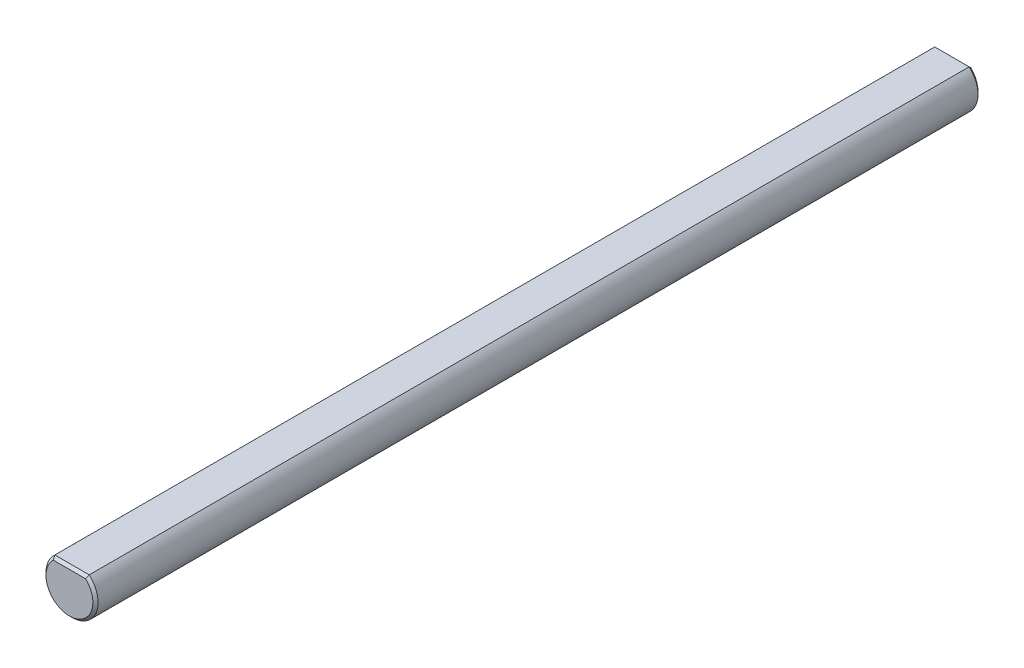
ISO-10303-21;
HEADER;
FILE_DESCRIPTION(('STEP AP214'),'2;1');
FILE_NAME('part.step','',(''),(''),'','','');
FILE_SCHEMA(('AUTOMOTIVE_DESIGN { 1 0 10303 214 1 1 1 1 }'));
ENDSEC;
DATA;
#1=APPLICATION_CONTEXT('core data for automotive mechanical design processes');
#2=APPLICATION_PROTOCOL_DEFINITION('international standard','automotive_design',2000,#1);
#3=PRODUCT_CONTEXT('',#1,'mechanical');
#4=PRODUCT('Part','Part','',(#3));
#5=PRODUCT_RELATED_PRODUCT_CATEGORY('part','',(#4));
#6=PRODUCT_DEFINITION_FORMATION('','',#4);
#7=PRODUCT_DEFINITION_CONTEXT('part definition',#1,'design');
#8=PRODUCT_DEFINITION('design','',#6,#7);
#9=PRODUCT_DEFINITION_SHAPE('','',#8);
#10=(LENGTH_UNIT() NAMED_UNIT(*) SI_UNIT(.MILLI.,.METRE.));
#11=(NAMED_UNIT(*) PLANE_ANGLE_UNIT() SI_UNIT($,.RADIAN.));
#12=(NAMED_UNIT(*) SI_UNIT($,.STERADIAN.) SOLID_ANGLE_UNIT());
#13=UNCERTAINTY_MEASURE_WITH_UNIT(LENGTH_MEASURE(1.E-05),#10,'distance_accuracy_value','');
#14=(GEOMETRIC_REPRESENTATION_CONTEXT(3) GLOBAL_UNCERTAINTY_ASSIGNED_CONTEXT((#13)) GLOBAL_UNIT_ASSIGNED_CONTEXT((#10,
#11,#12)) REPRESENTATION_CONTEXT('',''));
#15=CARTESIAN_POINT('',(0.,0.,0.));
#16=DIRECTION('',(0.,0.,1.));
#17=DIRECTION('',(1.,0.,0.));
#18=AXIS2_PLACEMENT_3D('',#15,#16,#17);
#19=CARTESIAN_POINT('',(0.,1.5,67.8));
#20=DIRECTION('',(0.,-0.707106781186535,-0.70710678118656));
#21=DIRECTION('',(0.,0.70710678118656,-0.707106781186535));
#22=AXIS2_PLACEMENT_3D('',#19,#20,#21);
#23=PLANE('',#22);
#24=CARTESIAN_POINT('',(-1.24498995985262,1.29999999997773,68.0000000000223));
#25=CARTESIAN_POINT('',(-1.25833682025397,1.33326211365269,67.9667378863473));
#26=CARTESIAN_POINT('',(-1.2715007301025,1.36655985040496,67.9334401495951));
#27=CARTESIAN_POINT('',(-1.29746262810463,1.43322651719354,67.8667734828065));
#28=CARTESIAN_POINT('',(-1.31026061683859,1.46659544711686,67.8334045528832));
#29=CARTESIAN_POINT('',(-1.3228756556001,1.50000000000447,67.7999999999956));
#30=B_SPLINE_CURVE_WITH_KNOTS('',3,(#24,#25,#26,#27,#28,#29),.UNSPECIFIED.,.F.,.F.,(4,2,4),(0.,
0.146686412504076,0.293372592346625),.UNSPECIFIED.);
#31=CARTESIAN_POINT('',(-1.24498995983232,1.30000000000002,68.0000000000202));
#32=VERTEX_POINT('',#31);
#33=CARTESIAN_POINT('',(-1.32287565556757,1.5,67.7999999999984));
#34=VERTEX_POINT('',#33);
#35=EDGE_CURVE('E62',#32,#34,#30,.T.);
#36=ORIENTED_EDGE('',*,*,#35,.F.);
#37=DIRECTION('',(1.,0.,0.));
#38=VECTOR('',#37,1.);
#39=CARTESIAN_POINT('',(0.,1.30000000000002,68.));
#40=LINE('',#39,#38);
#41=CARTESIAN_POINT('',(1.24498995982784,1.29999999998887,68.0000000000314));
#42=VERTEX_POINT('',#41);
#43=EDGE_CURVE('E74',#42,#32,#40,.F.);
#44=ORIENTED_EDGE('',*,*,#43,.F.);
#45=CARTESIAN_POINT('',(1.32287565560048,1.50000000000697,67.7999999999931));
#46=CARTESIAN_POINT('',(1.31026061683902,1.46659544711892,67.8334045528811));
#47=CARTESIAN_POINT('',(1.29746262810509,1.43322651719517,67.8667734828049));
#48=CARTESIAN_POINT('',(1.27150073010297,1.36655985040572,67.9334401495943));
#49=CARTESIAN_POINT('',(1.25833682025442,1.33326211365303,67.966737886347));
#50=CARTESIAN_POINT('',(1.24498995985304,1.29999999997765,68.0000000000224));
#51=B_SPLINE_CURVE_WITH_KNOTS('',3,(#45,#46,#47,#48,#49,#50),.UNSPECIFIED.,.F.,.F.,(4,2,4),(0.,
0.14668617984431,0.293372592350137),.UNSPECIFIED.);
#52=CARTESIAN_POINT('',(1.32287565555492,1.5000000000136,67.799999999995));
#53=VERTEX_POINT('',#52);
#54=EDGE_CURVE('E20',#53,#42,#51,.T.);
#55=ORIENTED_EDGE('',*,*,#54,.F.);
#56=DIRECTION('',(1.,0.,0.));
#57=VECTOR('',#56,1.);
#58=CARTESIAN_POINT('',(0.,1.5,67.7999999999967));
#59=LINE('',#58,#57);
#60=EDGE_CURVE('E72',#34,#53,#59,.T.);
#61=ORIENTED_EDGE('',*,*,#60,.F.);
#62=EDGE_LOOP('',(#36,#44,#55,#61));
#63=FACE_BOUND('',#62,.T.);
#64=ADVANCED_FACE('F16',(#63),#23,.F.);
#65=CARTESIAN_POINT('',(0.,1.30000000000001,0.));
#66=DIRECTION('',(0.,0.707106781186548,-0.707106781186548));
#67=DIRECTION('',(0.,0.707106781186548,0.707106781186548));
#68=AXIS2_PLACEMENT_3D('',#65,#66,#67);
#69=PLANE('',#68);
#70=CARTESIAN_POINT('',(1.24498995966781,1.30000000007249,5.93277109297435E-11));
#71=CARTESIAN_POINT('',(1.25833682006216,1.33326211373526,0.0332621137286757));
#72=CARTESIAN_POINT('',(1.27150072990423,1.36655985047632,0.0665598504741184));
#73=CARTESIAN_POINT('',(1.2974626278945,1.43322651724447,0.133226517246652));
#74=CARTESIAN_POINT('',(1.31026061662307,1.46659544715856,0.166595447160739));
#75=CARTESIAN_POINT('',(1.32287565537971,1.50000000003792,0.200000000037916));
#76=B_SPLINE_CURVE_WITH_KNOTS('',3,(#70,#71,#72,#73,#74,#75),.UNSPECIFIED.,.F.,.F.,(4,2,4),(0.,
0.146686412462035,0.293372592262553),.UNSPECIFIED.);
#77=CARTESIAN_POINT('',(1.24498995972611,1.30000000004097,9.00401427671733E-11));
#78=VERTEX_POINT('',#77);
#79=CARTESIAN_POINT('',(1.32287565544855,1.5,0.199999999999992));
#80=VERTEX_POINT('',#79);
#81=EDGE_CURVE('E75',#78,#80,#76,.T.);
#82=ORIENTED_EDGE('',*,*,#81,.F.);
#83=DIRECTION('',(1.,0.,0.));
#84=VECTOR('',#83,1.);
#85=CARTESIAN_POINT('',(0.,1.30000000001555,0.));
#86=LINE('',#85,#84);
#87=CARTESIAN_POINT('',(-1.24498995972611,1.30000000004097,9.00401310099296E-11));
#88=VERTEX_POINT('',#87);
#89=EDGE_CURVE('E87',#78,#88,#86,.F.);
#90=ORIENTED_EDGE('',*,*,#89,.T.);
#91=CARTESIAN_POINT('',(-1.32287565538282,1.50000000004767,0.200000000020283));
#92=CARTESIAN_POINT('',(-1.31026061662456,1.46659544716342,0.166595447149722));
#93=CARTESIAN_POINT('',(-1.29746262789475,1.43322651724557,0.133226517240994));
#94=CARTESIAN_POINT('',(-1.27150072990277,1.3665598504721,0.0665598504766577));
#95=CARTESIAN_POINT('',(-1.25833682006022,1.3332621137295,0.0332621137340537));
#96=CARTESIAN_POINT('',(-1.24498995966578,1.3000000000663,6.62875858197158E-11));
#97=B_SPLINE_CURVE_WITH_KNOTS('',3,(#91,#92,#93,#94,#95,#96),.UNSPECIFIED.,.F.,.F.,(4,2,4),(0.,
0.146686179798233,0.293372592258009),.UNSPECIFIED.);
#98=CARTESIAN_POINT('',(-1.32287565546389,1.50000000000973,0.200000000019124));
#99=VERTEX_POINT('',#98);
#100=EDGE_CURVE('E91',#99,#88,#97,.T.);
#101=ORIENTED_EDGE('',*,*,#100,.F.);
#102=DIRECTION('',(1.,0.,0.));
#103=VECTOR('',#102,1.);
#104=CARTESIAN_POINT('',(0.,1.5,0.199999999999992));
#105=LINE('',#104,#103);
#106=EDGE_CURVE('E82',#80,#99,#105,.F.);
#107=ORIENTED_EDGE('',*,*,#106,.F.);
#108=EDGE_LOOP('',(#82,#90,#101,#107));
#109=FACE_BOUND('',#108,.T.);
#110=ADVANCED_FACE('F112',(#109),#69,.T.);
#111=CARTESIAN_POINT('',(0.,0.,68.));
#112=DIRECTION('',(0.,0.,1.));
#113=DIRECTION('',(1.,0.,0.));
#114=AXIS2_PLACEMENT_3D('',#111,#112,#113);
#115=PLANE('',#114);
#116=ORIENTED_EDGE('',*,*,#43,.T.);
#117=CARTESIAN_POINT('',(0.,0.,68.0000000000405));
#118=DIRECTION('',(0.,0.,-1.));
#119=DIRECTION('',(-1.,0.,0.));
#120=AXIS2_PLACEMENT_3D('',#117,#118,#119);
#121=CIRCLE('',#120,1.80000000000291);
#122=EDGE_CURVE('E86',#42,#32,#121,.T.);
#123=ORIENTED_EDGE('',*,*,#122,.F.);
#124=EDGE_LOOP('',(#116,#123));
#125=FACE_BOUND('',#124,.T.);
#126=ADVANCED_FACE('F116',(#125),#115,.T.);
#127=CARTESIAN_POINT('',(0.,1.5,68.));
#128=DIRECTION('',(0.,1.,0.));
#129=DIRECTION('',(0.,0.,1.));
#130=AXIS2_PLACEMENT_3D('',#127,#128,#129);
#131=PLANE('',#130);
#132=DIRECTION('',(0.,0.,-1.));
#133=VECTOR('',#132,1.);
#134=CARTESIAN_POINT('',(1.32287565550936,1.50000000002023,68.));
#135=LINE('',#134,#133);
#136=EDGE_CURVE('E80',#80,#53,#135,.F.);
#137=ORIENTED_EDGE('',*,*,#136,.F.);
#138=ORIENTED_EDGE('',*,*,#106,.T.);
#139=DIRECTION('',(0.,0.,-1.));
#140=VECTOR('',#139,1.);
#141=CARTESIAN_POINT('',(-1.3228756555498,1.49999999998457,68.));
#142=LINE('',#141,#140);
#143=EDGE_CURVE('E81',#34,#99,#142,.T.);
#144=ORIENTED_EDGE('',*,*,#143,.F.);
#145=ORIENTED_EDGE('',*,*,#60,.T.);
#146=EDGE_LOOP('',(#137,#138,#144,#145));
#147=FACE_BOUND('',#146,.T.);
#148=ADVANCED_FACE('F78',(#147),#131,.T.);
#149=CARTESIAN_POINT('',(0.,0.,0.));
#150=DIRECTION('',(0.,0.,1.));
#151=DIRECTION('',(1.,0.,0.));
#152=AXIS2_PLACEMENT_3D('',#149,#150,#151);
#153=PLANE('',#152);
#154=ORIENTED_EDGE('',*,*,#89,.F.);
#155=CARTESIAN_POINT('',(0.,0.,1.13686837721616E-10));
#156=DIRECTION('',(0.,0.,1.));
#157=DIRECTION('',(1.,0.,0.));
#158=AXIS2_PLACEMENT_3D('',#155,#156,#157);
#159=CIRCLE('',#158,1.80000000000291);
#160=EDGE_CURVE('E68',#88,#78,#159,.T.);
#161=ORIENTED_EDGE('',*,*,#160,.F.);
#162=EDGE_LOOP('',(#154,#161));
#163=FACE_BOUND('',#162,.T.);
#164=ADVANCED_FACE('F132',(#163),#153,.F.);
#165=CARTESIAN_POINT('',(0.,0.,67.8000000000907));
#166=DIRECTION('',(0.,0.,-1.));
#167=DIRECTION('',(-1.,0.,0.));
#168=AXIS2_PLACEMENT_3D('',#165,#166,#167);
#169=CONICAL_SURFACE('',#168,1.99999999995271,0.785398163397448);
#170=ORIENTED_EDGE('',*,*,#122,.T.);
#171=ORIENTED_EDGE('',*,*,#35,.T.);
#172=CARTESIAN_POINT('',(0.,0.,67.8));
#173=DIRECTION('',(0.,0.,-1.));
#174=DIRECTION('',(-1.,0.,0.));
#175=AXIS2_PLACEMENT_3D('',#172,#173,#174);
#176=CIRCLE('',#175,2.);
#177=EDGE_CURVE('E31',#53,#34,#176,.T.);
#178=ORIENTED_EDGE('',*,*,#177,.F.);
#179=ORIENTED_EDGE('',*,*,#54,.T.);
#180=EDGE_LOOP('',(#170,#171,#178,#179));
#181=FACE_BOUND('',#180,.T.);
#182=ADVANCED_FACE('F59',(#181),#169,.T.);
#183=CARTESIAN_POINT('',(0.,0.,0.200000000063483));
#184=DIRECTION('',(0.,0.,1.));
#185=DIRECTION('',(1.,0.,0.));
#186=AXIS2_PLACEMENT_3D('',#183,#184,#185);
#187=CONICAL_SURFACE('',#186,1.99999999995271,0.785398163397448);
#188=ORIENTED_EDGE('',*,*,#160,.T.);
#189=ORIENTED_EDGE('',*,*,#81,.T.);
#190=CARTESIAN_POINT('',(0.,0.,0.199999999999992));
#191=DIRECTION('',(0.,0.,-1.));
#192=DIRECTION('',(-1.,0.,0.));
#193=AXIS2_PLACEMENT_3D('',#190,#191,#192);
#194=CIRCLE('',#193,2.);
#195=EDGE_CURVE('E11',#99,#80,#194,.F.);
#196=ORIENTED_EDGE('',*,*,#195,.F.);
#197=ORIENTED_EDGE('',*,*,#100,.T.);
#198=EDGE_LOOP('',(#188,#189,#196,#197));
#199=FACE_BOUND('',#198,.T.);
#200=ADVANCED_FACE('F109',(#199),#187,.T.);
#201=CARTESIAN_POINT('',(0.,0.,68.));
#202=DIRECTION('',(0.,0.,-1.));
#203=DIRECTION('',(-1.,0.,0.));
#204=AXIS2_PLACEMENT_3D('',#201,#202,#203);
#205=CYLINDRICAL_SURFACE('',#204,2.);
#206=ORIENTED_EDGE('',*,*,#177,.T.);
#207=ORIENTED_EDGE('',*,*,#143,.T.);
#208=ORIENTED_EDGE('',*,*,#195,.T.);
#209=ORIENTED_EDGE('',*,*,#136,.T.);
#210=EDGE_LOOP('',(#206,#207,#208,#209));
#211=FACE_BOUND('',#210,.T.);
#212=ADVANCED_FACE('F84',(#211),#205,.T.);
#213=CLOSED_SHELL('',(#64,#110,#126,#148,#164,#182,#200,#212));
#214=MANIFOLD_SOLID_BREP('B1',#213);
#215=ADVANCED_BREP_SHAPE_REPRESENTATION('',(#18,#214),#14);
#216=SHAPE_DEFINITION_REPRESENTATION(#9,#215);
ENDSEC;
END-ISO-10303-21;
